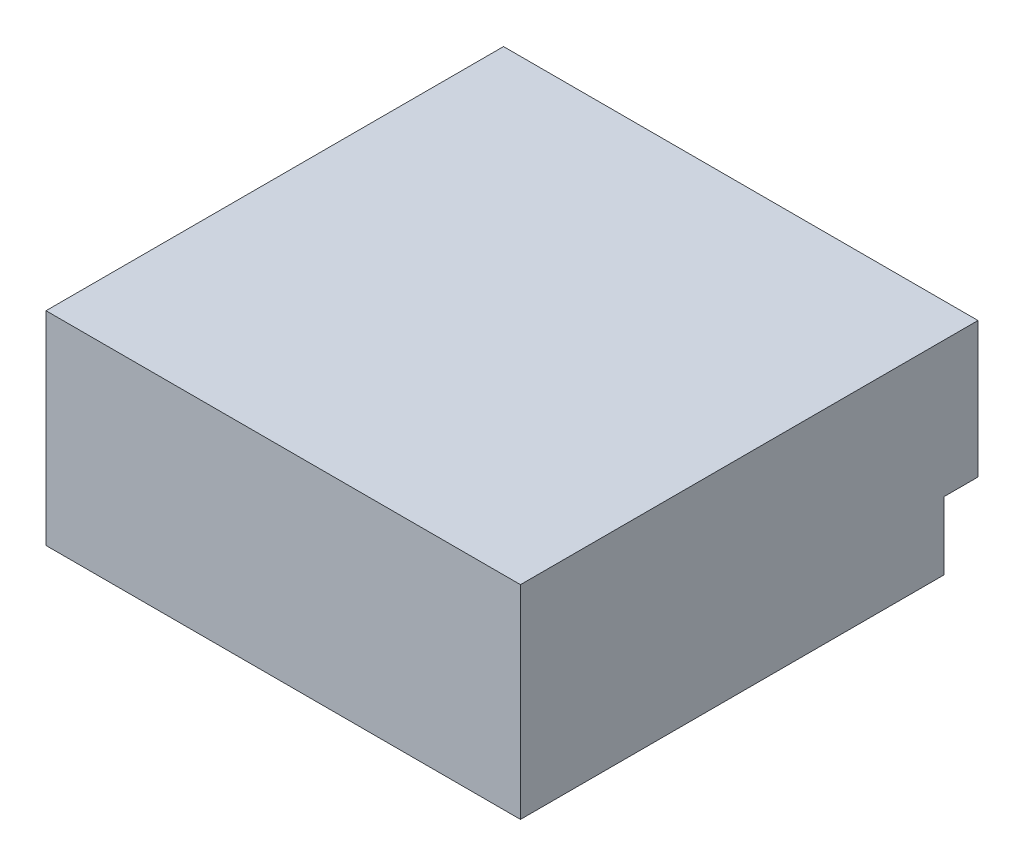
ISO-10303-21;
HEADER;
FILE_DESCRIPTION(('STEP AP214'),'2;1');
FILE_NAME('part.step','',(''),(''),'','','');
FILE_SCHEMA(('AUTOMOTIVE_DESIGN { 1 0 10303 214 1 1 1 1 }'));
ENDSEC;
DATA;
#1=APPLICATION_CONTEXT('core data for automotive mechanical design processes');
#2=APPLICATION_PROTOCOL_DEFINITION('international standard','automotive_design',2000,#1);
#3=PRODUCT_CONTEXT('',#1,'mechanical');
#4=PRODUCT('Part','Part','',(#3));
#5=PRODUCT_RELATED_PRODUCT_CATEGORY('part','',(#4));
#6=PRODUCT_DEFINITION_FORMATION('','',#4);
#7=PRODUCT_DEFINITION_CONTEXT('part definition',#1,'design');
#8=PRODUCT_DEFINITION('design','',#6,#7);
#9=PRODUCT_DEFINITION_SHAPE('','',#8);
#10=(LENGTH_UNIT() NAMED_UNIT(*) SI_UNIT(.MILLI.,.METRE.));
#11=(NAMED_UNIT(*) PLANE_ANGLE_UNIT() SI_UNIT($,.RADIAN.));
#12=(NAMED_UNIT(*) SI_UNIT($,.STERADIAN.) SOLID_ANGLE_UNIT());
#13=UNCERTAINTY_MEASURE_WITH_UNIT(LENGTH_MEASURE(1.E-05),#10,'distance_accuracy_value','');
#14=(GEOMETRIC_REPRESENTATION_CONTEXT(3) GLOBAL_UNCERTAINTY_ASSIGNED_CONTEXT((#13)) GLOBAL_UNIT_ASSIGNED_CONTEXT((#10,
#11,#12)) REPRESENTATION_CONTEXT('',''));
#15=CARTESIAN_POINT('',(0.,0.,0.));
#16=DIRECTION('',(0.,0.,1.));
#17=DIRECTION('',(1.,0.,0.));
#18=AXIS2_PLACEMENT_3D('',#15,#16,#17);
#19=CARTESIAN_POINT('',(0.,0.,12.7));
#20=DIRECTION('',(0.,0.,1.));
#21=DIRECTION('',(1.,0.,0.));
#22=AXIS2_PLACEMENT_3D('',#19,#20,#21);
#23=PLANE('',#22);
#24=DIRECTION('',(-1.,0.,0.));
#25=VECTOR('',#24,1.);
#26=CARTESIAN_POINT('',(-88.9,-38.1,12.7));
#27=LINE('',#26,#25);
#28=CARTESIAN_POINT('',(-38.1,-38.1,12.7));
#29=VERTEX_POINT('',#28);
#30=CARTESIAN_POINT('',(-88.9,-38.1,12.7));
#31=VERTEX_POINT('',#30);
#32=EDGE_CURVE('E113',#29,#31,#27,.T.);
#33=ORIENTED_EDGE('',*,*,#32,.T.);
#34=DIRECTION('',(0.,1.,0.));
#35=VECTOR('',#34,1.);
#36=CARTESIAN_POINT('',(-88.9,-38.1,12.7));
#37=LINE('',#36,#35);
#38=CARTESIAN_POINT('',(-88.9,-12.7,12.7));
#39=VERTEX_POINT('',#38);
#40=EDGE_CURVE('E117',#31,#39,#37,.T.);
#41=ORIENTED_EDGE('',*,*,#40,.T.);
#42=DIRECTION('',(1.,0.,0.));
#43=VECTOR('',#42,1.);
#44=CARTESIAN_POINT('',(-88.9,-12.7,12.7));
#45=LINE('',#44,#43);
#46=CARTESIAN_POINT('',(-38.1,-12.7,12.7));
#47=VERTEX_POINT('',#46);
#48=EDGE_CURVE('E130',#39,#47,#45,.T.);
#49=ORIENTED_EDGE('',*,*,#48,.T.);
#50=DIRECTION('',(0.,-1.,0.));
#51=VECTOR('',#50,1.);
#52=CARTESIAN_POINT('',(-38.1,-38.1,12.7));
#53=LINE('',#52,#51);
#54=EDGE_CURVE('E119',#47,#29,#53,.T.);
#55=ORIENTED_EDGE('',*,*,#54,.T.);
#56=EDGE_LOOP('',(#33,#41,#49,#55));
#57=FACE_BOUND('',#56,.T.);
#58=CARTESIAN_POINT('',(-63.5,-25.4,12.7));
#59=DIRECTION('',(0.,0.,1.));
#60=DIRECTION('',(1.,0.,0.));
#61=AXIS2_PLACEMENT_3D('',#58,#59,#60);
#62=CIRCLE('',#61,6.35);
#63=CARTESIAN_POINT('',(-57.15,-25.4,12.7));
#64=VERTEX_POINT('',#63);
#65=EDGE_CURVE('E11',#64,#64,#62,.F.);
#66=ORIENTED_EDGE('',*,*,#65,.F.);
#67=EDGE_LOOP('',(#66));
#68=FACE_BOUND('',#67,.T.);
#69=ADVANCED_FACE('F32',(#57,#68),#23,.F.);
#70=CARTESIAN_POINT('',(0.,0.,12.7));
#71=DIRECTION('',(0.,0.,1.));
#72=DIRECTION('',(1.,0.,0.));
#73=AXIS2_PLACEMENT_3D('',#70,#71,#72);
#74=PLANE('',#73);
#75=DIRECTION('',(0.,-1.,0.));
#76=VECTOR('',#75,1.);
#77=CARTESIAN_POINT('',(88.9,-38.1,12.7));
#78=LINE('',#77,#76);
#79=CARTESIAN_POINT('',(88.9,-12.7,12.7));
#80=VERTEX_POINT('',#79);
#81=CARTESIAN_POINT('',(88.9,-38.1,12.7));
#82=VERTEX_POINT('',#81);
#83=EDGE_CURVE('E222',#80,#82,#78,.T.);
#84=ORIENTED_EDGE('',*,*,#83,.T.);
#85=DIRECTION('',(-1.,0.,0.));
#86=VECTOR('',#85,1.);
#87=CARTESIAN_POINT('',(88.9,-38.1,12.7));
#88=LINE('',#87,#86);
#89=CARTESIAN_POINT('',(38.1,-38.1,12.7));
#90=VERTEX_POINT('',#89);
#91=EDGE_CURVE('E232',#82,#90,#88,.T.);
#92=ORIENTED_EDGE('',*,*,#91,.T.);
#93=DIRECTION('',(0.,1.,0.));
#94=VECTOR('',#93,1.);
#95=CARTESIAN_POINT('',(38.1,-38.1,12.7));
#96=LINE('',#95,#94);
#97=CARTESIAN_POINT('',(38.1,-12.7,12.7));
#98=VERTEX_POINT('',#97);
#99=EDGE_CURVE('E229',#90,#98,#96,.T.);
#100=ORIENTED_EDGE('',*,*,#99,.T.);
#101=DIRECTION('',(1.,0.,0.));
#102=VECTOR('',#101,1.);
#103=CARTESIAN_POINT('',(88.9,-12.7,12.7));
#104=LINE('',#103,#102);
#105=EDGE_CURVE('E216',#98,#80,#104,.T.);
#106=ORIENTED_EDGE('',*,*,#105,.T.);
#107=EDGE_LOOP('',(#84,#92,#100,#106));
#108=FACE_BOUND('',#107,.T.);
#109=CARTESIAN_POINT('',(63.5,-25.4,12.7));
#110=DIRECTION('',(0.,0.,1.));
#111=DIRECTION('',(1.,0.,0.));
#112=AXIS2_PLACEMENT_3D('',#109,#110,#111);
#113=CIRCLE('',#112,6.35);
#114=CARTESIAN_POINT('',(69.85,-25.4,12.7));
#115=VERTEX_POINT('',#114);
#116=EDGE_CURVE('E40',#115,#115,#113,.F.);
#117=ORIENTED_EDGE('',*,*,#116,.F.);
#118=EDGE_LOOP('',(#117));
#119=FACE_BOUND('',#118,.T.);
#120=ADVANCED_FACE('F151',(#108,#119),#74,.F.);
#121=CARTESIAN_POINT('',(88.9,38.1,171.45));
#122=DIRECTION('',(-1.,0.,0.));
#123=DIRECTION('',(0.,-1.,0.));
#124=AXIS2_PLACEMENT_3D('',#121,#122,#123);
#125=PLANE('',#124);
#126=ORIENTED_EDGE('',*,*,#83,.F.);
#127=DIRECTION('',(0.,0.,-1.));
#128=VECTOR('',#127,1.);
#129=CARTESIAN_POINT('',(88.9,-12.7,12.7));
#130=LINE('',#129,#128);
#131=CARTESIAN_POINT('',(88.9,-12.7,0.));
#132=VERTEX_POINT('',#131);
#133=EDGE_CURVE('E206',#80,#132,#130,.T.);
#134=ORIENTED_EDGE('',*,*,#133,.T.);
#135=DIRECTION('',(0.,1.,0.));
#136=VECTOR('',#135,1.);
#137=CARTESIAN_POINT('',(88.9,38.1,0.));
#138=LINE('',#137,#136);
#139=CARTESIAN_POINT('',(88.9,38.1,0.));
#140=VERTEX_POINT('',#139);
#141=EDGE_CURVE('E197',#132,#140,#138,.T.);
#142=ORIENTED_EDGE('',*,*,#141,.T.);
#143=DIRECTION('',(0.,0.,-1.));
#144=VECTOR('',#143,1.);
#145=CARTESIAN_POINT('',(88.9,38.1,171.45));
#146=LINE('',#145,#144);
#147=CARTESIAN_POINT('',(88.9,38.1,171.45));
#148=VERTEX_POINT('',#147);
#149=EDGE_CURVE('E139',#148,#140,#146,.T.);
#150=ORIENTED_EDGE('',*,*,#149,.F.);
#151=DIRECTION('',(0.,1.,0.));
#152=VECTOR('',#151,1.);
#153=CARTESIAN_POINT('',(88.9,38.1,171.45));
#154=LINE('',#153,#152);
#155=CARTESIAN_POINT('',(88.9,-38.1,171.45));
#156=VERTEX_POINT('',#155);
#157=EDGE_CURVE('E203',#156,#148,#154,.T.);
#158=ORIENTED_EDGE('',*,*,#157,.F.);
#159=DIRECTION('',(0.,0.,-1.));
#160=VECTOR('',#159,1.);
#161=CARTESIAN_POINT('',(88.9,-38.1,171.45));
#162=LINE('',#161,#160);
#163=EDGE_CURVE('E136',#156,#82,#162,.T.);
#164=ORIENTED_EDGE('',*,*,#163,.T.);
#165=EDGE_LOOP('',(#126,#134,#142,#150,#158,#164));
#166=FACE_BOUND('',#165,.T.);
#167=ADVANCED_FACE('F34',(#166),#125,.F.);
#168=CARTESIAN_POINT('',(-88.9,38.1,171.45));
#169=DIRECTION('',(0.,-1.,0.));
#170=DIRECTION('',(0.,0.,-1.));
#171=AXIS2_PLACEMENT_3D('',#168,#169,#170);
#172=PLANE('',#171);
#173=DIRECTION('',(-1.,0.,0.));
#174=VECTOR('',#173,1.);
#175=CARTESIAN_POINT('',(-88.9,38.1,0.));
#176=LINE('',#175,#174);
#177=CARTESIAN_POINT('',(-88.9,38.1,0.));
#178=VERTEX_POINT('',#177);
#179=EDGE_CURVE('E192',#140,#178,#176,.T.);
#180=ORIENTED_EDGE('',*,*,#179,.T.);
#181=DIRECTION('',(0.,0.,-1.));
#182=VECTOR('',#181,1.);
#183=CARTESIAN_POINT('',(-88.9,38.1,171.45));
#184=LINE('',#183,#182);
#185=CARTESIAN_POINT('',(-88.9,38.1,171.45));
#186=VERTEX_POINT('',#185);
#187=EDGE_CURVE('E135',#186,#178,#184,.T.);
#188=ORIENTED_EDGE('',*,*,#187,.F.);
#189=DIRECTION('',(-1.,0.,0.));
#190=VECTOR('',#189,1.);
#191=CARTESIAN_POINT('',(-88.9,38.1,171.45));
#192=LINE('',#191,#190);
#193=EDGE_CURVE('E209',#148,#186,#192,.T.);
#194=ORIENTED_EDGE('',*,*,#193,.F.);
#195=ORIENTED_EDGE('',*,*,#149,.T.);
#196=EDGE_LOOP('',(#180,#188,#194,#195));
#197=FACE_BOUND('',#196,.T.);
#198=ADVANCED_FACE('F159',(#197),#172,.F.);
#199=CARTESIAN_POINT('',(-88.9,38.1,171.45));
#200=DIRECTION('',(1.,0.,0.));
#201=DIRECTION('',(0.,1.,0.));
#202=AXIS2_PLACEMENT_3D('',#199,#200,#201);
#203=PLANE('',#202);
#204=DIRECTION('',(0.,-1.,0.));
#205=VECTOR('',#204,1.);
#206=CARTESIAN_POINT('',(-88.9,38.1,0.));
#207=LINE('',#206,#205);
#208=CARTESIAN_POINT('',(-88.9,-12.7,0.));
#209=VERTEX_POINT('',#208);
#210=EDGE_CURVE('E196',#178,#209,#207,.T.);
#211=ORIENTED_EDGE('',*,*,#210,.T.);
#212=DIRECTION('',(0.,0.,-1.));
#213=VECTOR('',#212,1.);
#214=CARTESIAN_POINT('',(-88.9,-12.7,12.7));
#215=LINE('',#214,#213);
#216=EDGE_CURVE('E47',#39,#209,#215,.T.);
#217=ORIENTED_EDGE('',*,*,#216,.F.);
#218=ORIENTED_EDGE('',*,*,#40,.F.);
#219=DIRECTION('',(0.,0.,-1.));
#220=VECTOR('',#219,1.);
#221=CARTESIAN_POINT('',(-88.8999999999999,-38.1,171.45));
#222=LINE('',#221,#220);
#223=CARTESIAN_POINT('',(-88.8999999999999,-38.1,171.45));
#224=VERTEX_POINT('',#223);
#225=EDGE_CURVE('E128',#224,#31,#222,.T.);
#226=ORIENTED_EDGE('',*,*,#225,.F.);
#227=DIRECTION('',(0.,-1.,0.));
#228=VECTOR('',#227,1.);
#229=CARTESIAN_POINT('',(-88.9,38.1,171.45));
#230=LINE('',#229,#228);
#231=EDGE_CURVE('E199',#186,#224,#230,.T.);
#232=ORIENTED_EDGE('',*,*,#231,.F.);
#233=ORIENTED_EDGE('',*,*,#187,.T.);
#234=EDGE_LOOP('',(#211,#217,#218,#226,#232,#233));
#235=FACE_BOUND('',#234,.T.);
#236=ADVANCED_FACE('F126',(#235),#203,.F.);
#237=CARTESIAN_POINT('',(-88.8999999999999,-38.1,171.45));
#238=DIRECTION('',(0.,1.,0.));
#239=DIRECTION('',(0.,0.,1.));
#240=AXIS2_PLACEMENT_3D('',#237,#238,#239);
#241=PLANE('',#240);
#242=ORIENTED_EDGE('',*,*,#32,.F.);
#243=DIRECTION('',(0.,0.,-1.));
#244=VECTOR('',#243,1.);
#245=CARTESIAN_POINT('',(-38.1,-38.1,12.7));
#246=LINE('',#245,#244);
#247=CARTESIAN_POINT('',(-38.1,-38.1,0.));
#248=VERTEX_POINT('',#247);
#249=EDGE_CURVE('E226',#29,#248,#246,.T.);
#250=ORIENTED_EDGE('',*,*,#249,.T.);
#251=DIRECTION('',(1.,0.,0.));
#252=VECTOR('',#251,1.);
#253=CARTESIAN_POINT('',(-88.8999999999999,-38.1,0.));
#254=LINE('',#253,#252);
#255=CARTESIAN_POINT('',(38.1,-38.1,0.));
#256=VERTEX_POINT('',#255);
#257=EDGE_CURVE('E55',#248,#256,#254,.T.);
#258=ORIENTED_EDGE('',*,*,#257,.T.);
#259=DIRECTION('',(0.,0.,-1.));
#260=VECTOR('',#259,1.);
#261=CARTESIAN_POINT('',(38.1,-38.1,12.7));
#262=LINE('',#261,#260);
#263=EDGE_CURVE('E213',#90,#256,#262,.T.);
#264=ORIENTED_EDGE('',*,*,#263,.F.);
#265=ORIENTED_EDGE('',*,*,#91,.F.);
#266=ORIENTED_EDGE('',*,*,#163,.F.);
#267=DIRECTION('',(1.,0.,0.));
#268=VECTOR('',#267,1.);
#269=CARTESIAN_POINT('',(-88.8999999999999,-38.1,171.45));
#270=LINE('',#269,#268);
#271=EDGE_CURVE('E134',#224,#156,#270,.T.);
#272=ORIENTED_EDGE('',*,*,#271,.F.);
#273=ORIENTED_EDGE('',*,*,#225,.T.);
#274=EDGE_LOOP('',(#242,#250,#258,#264,#265,#266,#272,#273));
#275=FACE_BOUND('',#274,.T.);
#276=ADVANCED_FACE('F132',(#275),#241,.F.);
#277=CARTESIAN_POINT('',(0.,0.,171.45));
#278=DIRECTION('',(0.,0.,1.));
#279=DIRECTION('',(1.,0.,0.));
#280=AXIS2_PLACEMENT_3D('',#277,#278,#279);
#281=PLANE('',#280);
#282=ORIENTED_EDGE('',*,*,#157,.T.);
#283=ORIENTED_EDGE('',*,*,#193,.T.);
#284=ORIENTED_EDGE('',*,*,#231,.T.);
#285=ORIENTED_EDGE('',*,*,#271,.T.);
#286=EDGE_LOOP('',(#282,#283,#284,#285));
#287=FACE_BOUND('',#286,.T.);
#288=ADVANCED_FACE('F176',(#287),#281,.T.);
#289=CARTESIAN_POINT('',(0.,0.,0.));
#290=DIRECTION('',(0.,0.,1.));
#291=DIRECTION('',(1.,0.,0.));
#292=AXIS2_PLACEMENT_3D('',#289,#290,#291);
#293=PLANE('',#292);
#294=ORIENTED_EDGE('',*,*,#257,.F.);
#295=DIRECTION('',(0.,-1.,0.));
#296=VECTOR('',#295,1.);
#297=CARTESIAN_POINT('',(-38.1,-38.1,0.));
#298=LINE('',#297,#296);
#299=CARTESIAN_POINT('',(-38.1,-12.7,0.));
#300=VERTEX_POINT('',#299);
#301=EDGE_CURVE('E121',#300,#248,#298,.T.);
#302=ORIENTED_EDGE('',*,*,#301,.F.);
#303=DIRECTION('',(1.,0.,0.));
#304=VECTOR('',#303,1.);
#305=CARTESIAN_POINT('',(-88.9,-12.7,0.));
#306=LINE('',#305,#304);
#307=EDGE_CURVE('E201',#209,#300,#306,.T.);
#308=ORIENTED_EDGE('',*,*,#307,.F.);
#309=ORIENTED_EDGE('',*,*,#210,.F.);
#310=ORIENTED_EDGE('',*,*,#179,.F.);
#311=ORIENTED_EDGE('',*,*,#141,.F.);
#312=DIRECTION('',(1.,0.,0.));
#313=VECTOR('',#312,1.);
#314=CARTESIAN_POINT('',(88.9,-12.7,0.));
#315=LINE('',#314,#313);
#316=CARTESIAN_POINT('',(38.1,-12.7,0.));
#317=VERTEX_POINT('',#316);
#318=EDGE_CURVE('E220',#317,#132,#315,.T.);
#319=ORIENTED_EDGE('',*,*,#318,.F.);
#320=DIRECTION('',(0.,1.,0.));
#321=VECTOR('',#320,1.);
#322=CARTESIAN_POINT('',(38.1,-38.1,0.));
#323=LINE('',#322,#321);
#324=EDGE_CURVE('E223',#256,#317,#323,.T.);
#325=ORIENTED_EDGE('',*,*,#324,.F.);
#326=EDGE_LOOP('',(#294,#302,#308,#309,#310,#311,#319,#325));
#327=FACE_BOUND('',#326,.T.);
#328=ADVANCED_FACE('F170',(#327),#293,.F.);
#329=CARTESIAN_POINT('',(88.9,-12.7,12.7));
#330=DIRECTION('',(0.,1.,0.));
#331=DIRECTION('',(0.,0.,1.));
#332=AXIS2_PLACEMENT_3D('',#329,#330,#331);
#333=PLANE('',#332);
#334=ORIENTED_EDGE('',*,*,#318,.T.);
#335=ORIENTED_EDGE('',*,*,#133,.F.);
#336=ORIENTED_EDGE('',*,*,#105,.F.);
#337=DIRECTION('',(0.,0.,-1.));
#338=VECTOR('',#337,1.);
#339=CARTESIAN_POINT('',(38.1,-12.7,12.7));
#340=LINE('',#339,#338);
#341=EDGE_CURVE('E215',#98,#317,#340,.T.);
#342=ORIENTED_EDGE('',*,*,#341,.T.);
#343=EDGE_LOOP('',(#334,#335,#336,#342));
#344=FACE_BOUND('',#343,.T.);
#345=ADVANCED_FACE('F166',(#344),#333,.F.);
#346=CARTESIAN_POINT('',(38.1,-38.1,12.7));
#347=DIRECTION('',(-1.,0.,0.));
#348=DIRECTION('',(0.,0.,1.));
#349=AXIS2_PLACEMENT_3D('',#346,#347,#348);
#350=PLANE('',#349);
#351=ORIENTED_EDGE('',*,*,#324,.T.);
#352=ORIENTED_EDGE('',*,*,#341,.F.);
#353=ORIENTED_EDGE('',*,*,#99,.F.);
#354=ORIENTED_EDGE('',*,*,#263,.T.);
#355=EDGE_LOOP('',(#351,#352,#353,#354));
#356=FACE_BOUND('',#355,.T.);
#357=ADVANCED_FACE('F169',(#356),#350,.F.);
#358=CARTESIAN_POINT('',(-38.1,-38.1,12.7));
#359=DIRECTION('',(1.,0.,0.));
#360=DIRECTION('',(0.,0.,-1.));
#361=AXIS2_PLACEMENT_3D('',#358,#359,#360);
#362=PLANE('',#361);
#363=ORIENTED_EDGE('',*,*,#301,.T.);
#364=ORIENTED_EDGE('',*,*,#249,.F.);
#365=ORIENTED_EDGE('',*,*,#54,.F.);
#366=DIRECTION('',(0.,0.,-1.));
#367=VECTOR('',#366,1.);
#368=CARTESIAN_POINT('',(-38.1,-12.7,12.7));
#369=LINE('',#368,#367);
#370=EDGE_CURVE('E237',#47,#300,#369,.T.);
#371=ORIENTED_EDGE('',*,*,#370,.T.);
#372=EDGE_LOOP('',(#363,#364,#365,#371));
#373=FACE_BOUND('',#372,.T.);
#374=ADVANCED_FACE('F174',(#373),#362,.F.);
#375=CARTESIAN_POINT('',(-88.9,-12.7,12.7));
#376=DIRECTION('',(0.,1.,0.));
#377=DIRECTION('',(0.,0.,1.));
#378=AXIS2_PLACEMENT_3D('',#375,#376,#377);
#379=PLANE('',#378);
#380=ORIENTED_EDGE('',*,*,#307,.T.);
#381=ORIENTED_EDGE('',*,*,#370,.F.);
#382=ORIENTED_EDGE('',*,*,#48,.F.);
#383=ORIENTED_EDGE('',*,*,#216,.T.);
#384=EDGE_LOOP('',(#380,#381,#382,#383));
#385=FACE_BOUND('',#384,.T.);
#386=ADVANCED_FACE('F164',(#385),#379,.F.);
#387=CARTESIAN_POINT('',(63.5,-25.4,6.35));
#388=DIRECTION('',(0.,0.,1.));
#389=DIRECTION('',(1.,0.,0.));
#390=AXIS2_PLACEMENT_3D('',#387,#388,#389);
#391=CYLINDRICAL_SURFACE('',#390,6.35);
#392=CARTESIAN_POINT('',(63.5,-25.4,6.35));
#393=DIRECTION('',(0.,0.,-1.));
#394=DIRECTION('',(-1.,0.,0.));
#395=AXIS2_PLACEMENT_3D('',#392,#393,#394);
#396=CIRCLE('',#395,6.35);
#397=CARTESIAN_POINT('',(57.15,-25.4,6.35));
#398=VERTEX_POINT('',#397);
#399=EDGE_CURVE('E242',#398,#398,#396,.T.);
#400=ORIENTED_EDGE('',*,*,#399,.F.);
#401=EDGE_LOOP('',(#400));
#402=FACE_BOUND('',#401,.T.);
#403=ORIENTED_EDGE('',*,*,#116,.T.);
#404=EDGE_LOOP('',(#403));
#405=FACE_BOUND('',#404,.T.);
#406=ADVANCED_FACE('F149',(#402,#405),#391,.T.);
#407=CARTESIAN_POINT('',(63.5,-25.4,6.35));
#408=DIRECTION('',(0.,0.,-1.));
#409=DIRECTION('',(-1.,0.,0.));
#410=AXIS2_PLACEMENT_3D('',#407,#408,#409);
#411=PLANE('',#410);
#412=ORIENTED_EDGE('',*,*,#399,.T.);
#413=EDGE_LOOP('',(#412));
#414=FACE_BOUND('',#413,.T.);
#415=ADVANCED_FACE('F256',(#414),#411,.T.);
#416=CARTESIAN_POINT('',(-63.5,-25.4,6.35));
#417=DIRECTION('',(0.,0.,1.));
#418=DIRECTION('',(1.,0.,0.));
#419=AXIS2_PLACEMENT_3D('',#416,#417,#418);
#420=CYLINDRICAL_SURFACE('',#419,6.35);
#421=CARTESIAN_POINT('',(-63.5,-25.4,6.35));
#422=DIRECTION('',(0.,0.,-1.));
#423=DIRECTION('',(1.,0.,0.));
#424=AXIS2_PLACEMENT_3D('',#421,#422,#423);
#425=CIRCLE('',#424,6.35);
#426=CARTESIAN_POINT('',(-57.15,-25.4,6.35));
#427=VERTEX_POINT('',#426);
#428=EDGE_CURVE('E247',#427,#427,#425,.T.);
#429=ORIENTED_EDGE('',*,*,#428,.F.);
#430=EDGE_LOOP('',(#429));
#431=FACE_BOUND('',#430,.T.);
#432=ORIENTED_EDGE('',*,*,#65,.T.);
#433=EDGE_LOOP('',(#432));
#434=FACE_BOUND('',#433,.T.);
#435=ADVANCED_FACE('F253',(#431,#434),#420,.T.);
#436=CARTESIAN_POINT('',(-63.5,-25.4,6.35));
#437=DIRECTION('',(0.,0.,1.));
#438=DIRECTION('',(1.,0.,0.));
#439=AXIS2_PLACEMENT_3D('',#436,#437,#438);
#440=PLANE('',#439);
#441=ORIENTED_EDGE('',*,*,#428,.T.);
#442=EDGE_LOOP('',(#441));
#443=FACE_BOUND('',#442,.T.);
#444=ADVANCED_FACE('F251',(#443),#440,.F.);
#445=CLOSED_SHELL('',(#69,#120,#167,#198,#236,#276,#288,#328,#345,#357,#374,#386,#406,#415,#435,#444));
#446=MANIFOLD_SOLID_BREP('B2',#445);
#447=ADVANCED_BREP_SHAPE_REPRESENTATION('',(#18,#446),#14);
#448=SHAPE_DEFINITION_REPRESENTATION(#9,#447);
ENDSEC;
END-ISO-10303-21;
